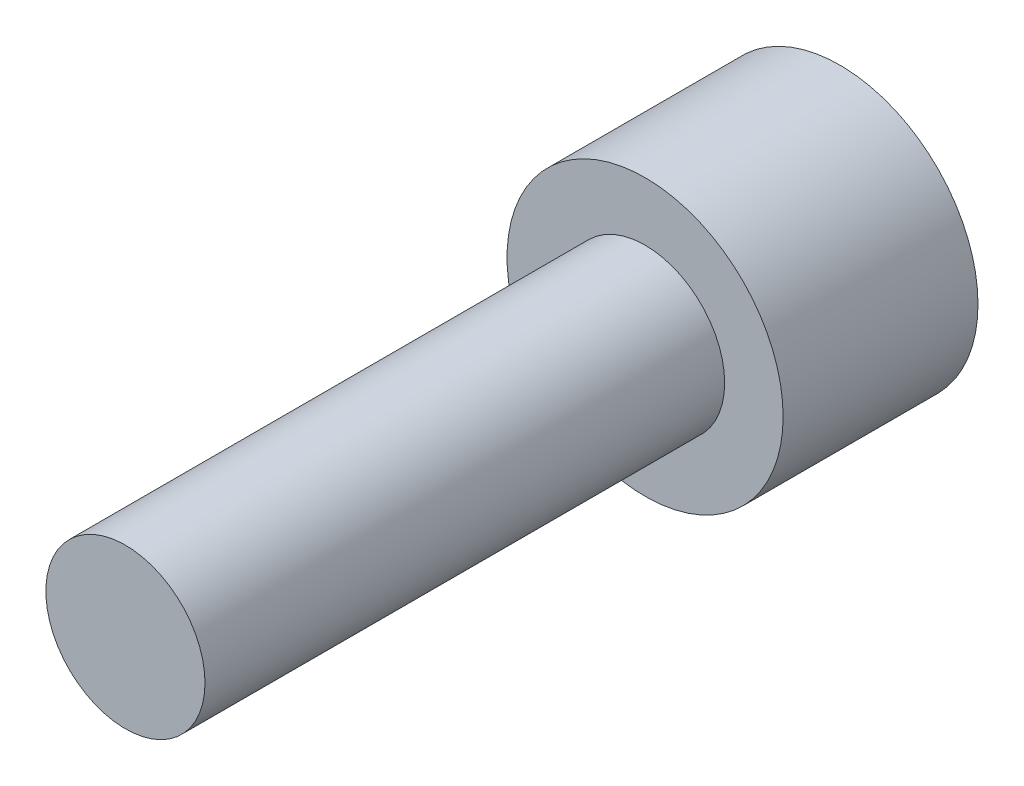
ISO-10303-21;
HEADER;
FILE_DESCRIPTION(('STEP AP214'),'2;1');
FILE_NAME('part.step','',(''),(''),'','','');
FILE_SCHEMA(('AUTOMOTIVE_DESIGN { 1 0 10303 214 1 1 1 1 }'));
ENDSEC;
DATA;
#1=APPLICATION_CONTEXT('core data for automotive mechanical design processes');
#2=APPLICATION_PROTOCOL_DEFINITION('international standard','automotive_design',2000,#1);
#3=PRODUCT_CONTEXT('',#1,'mechanical');
#4=PRODUCT('Part','Part','',(#3));
#5=PRODUCT_RELATED_PRODUCT_CATEGORY('part','',(#4));
#6=PRODUCT_DEFINITION_FORMATION('','',#4);
#7=PRODUCT_DEFINITION_CONTEXT('part definition',#1,'design');
#8=PRODUCT_DEFINITION('design','',#6,#7);
#9=PRODUCT_DEFINITION_SHAPE('','',#8);
#10=(LENGTH_UNIT() NAMED_UNIT(*) SI_UNIT(.MILLI.,.METRE.));
#11=(NAMED_UNIT(*) PLANE_ANGLE_UNIT() SI_UNIT($,.RADIAN.));
#12=(NAMED_UNIT(*) SI_UNIT($,.STERADIAN.) SOLID_ANGLE_UNIT());
#13=UNCERTAINTY_MEASURE_WITH_UNIT(LENGTH_MEASURE(1.E-05),#10,'distance_accuracy_value','');
#14=(GEOMETRIC_REPRESENTATION_CONTEXT(3) GLOBAL_UNCERTAINTY_ASSIGNED_CONTEXT((#13)) GLOBAL_UNIT_ASSIGNED_CONTEXT((#10,
#11,#12)) REPRESENTATION_CONTEXT('',''));
#15=CARTESIAN_POINT('',(0.,0.,0.));
#16=DIRECTION('',(0.,0.,1.));
#17=DIRECTION('',(1.,0.,0.));
#18=AXIS2_PLACEMENT_3D('',#15,#16,#17);
#19=CARTESIAN_POINT('',(0.,0.,6.));
#20=DIRECTION('',(0.,0.,-1.));
#21=DIRECTION('',(-1.,0.,0.));
#22=AXIS2_PLACEMENT_3D('',#19,#20,#21);
#23=CYLINDRICAL_SURFACE('',#22,4.25);
#24=CARTESIAN_POINT('',(0.,0.,6.));
#25=DIRECTION('',(0.,0.,1.));
#26=DIRECTION('',(1.,0.,0.));
#27=AXIS2_PLACEMENT_3D('',#24,#25,#26);
#28=CIRCLE('',#27,4.25);
#29=CARTESIAN_POINT('',(4.25,0.,6.));
#30=VERTEX_POINT('',#29);
#31=EDGE_CURVE('E40',#30,#30,#28,.T.);
#32=ORIENTED_EDGE('',*,*,#31,.F.);
#33=EDGE_LOOP('',(#32));
#34=FACE_BOUND('',#33,.T.);
#35=CARTESIAN_POINT('',(0.,0.,0.));
#36=DIRECTION('',(0.,0.,1.));
#37=DIRECTION('',(1.,0.,0.));
#38=AXIS2_PLACEMENT_3D('',#35,#36,#37);
#39=CIRCLE('',#38,4.25);
#40=CARTESIAN_POINT('',(4.25,0.,0.));
#41=VERTEX_POINT('',#40);
#42=EDGE_CURVE('E36',#41,#41,#39,.T.);
#43=ORIENTED_EDGE('',*,*,#42,.T.);
#44=EDGE_LOOP('',(#43));
#45=FACE_BOUND('',#44,.T.);
#46=ADVANCED_FACE('F33',(#34,#45),#23,.T.);
#47=CARTESIAN_POINT('',(0.,0.,6.));
#48=DIRECTION('',(0.,0.,1.));
#49=DIRECTION('',(1.,0.,0.));
#50=AXIS2_PLACEMENT_3D('',#47,#48,#49);
#51=PLANE('',#50);
#52=CARTESIAN_POINT('',(0.,0.,6.));
#53=DIRECTION('',(0.,0.,1.));
#54=DIRECTION('',(1.,0.,0.));
#55=AXIS2_PLACEMENT_3D('',#52,#53,#54);
#56=CIRCLE('',#55,2.45);
#57=CARTESIAN_POINT('',(2.45,0.,6.));
#58=VERTEX_POINT('',#57);
#59=EDGE_CURVE('E10',#58,#58,#56,.T.);
#60=ORIENTED_EDGE('',*,*,#59,.F.);
#61=EDGE_LOOP('',(#60));
#62=FACE_BOUND('',#61,.T.);
#63=ORIENTED_EDGE('',*,*,#31,.T.);
#64=EDGE_LOOP('',(#63));
#65=FACE_BOUND('',#64,.T.);
#66=ADVANCED_FACE('F57',(#62,#65),#51,.T.);
#67=CARTESIAN_POINT('',(0.,0.,0.));
#68=DIRECTION('',(0.,0.,1.));
#69=DIRECTION('',(1.,0.,0.));
#70=AXIS2_PLACEMENT_3D('',#67,#68,#69);
#71=PLANE('',#70);
#72=ORIENTED_EDGE('',*,*,#42,.F.);
#73=EDGE_LOOP('',(#72));
#74=FACE_BOUND('',#73,.T.);
#75=ADVANCED_FACE('F54',(#74),#71,.F.);
#76=CARTESIAN_POINT('',(0.,0.,22.));
#77=DIRECTION('',(0.,0.,-1.));
#78=DIRECTION('',(-1.,0.,0.));
#79=AXIS2_PLACEMENT_3D('',#76,#77,#78);
#80=CYLINDRICAL_SURFACE('',#79,2.45);
#81=CARTESIAN_POINT('',(0.,0.,22.));
#82=DIRECTION('',(0.,0.,1.));
#83=DIRECTION('',(1.,0.,0.));
#84=AXIS2_PLACEMENT_3D('',#81,#82,#83);
#85=CIRCLE('',#84,2.45);
#86=CARTESIAN_POINT('',(2.45,0.,22.));
#87=VERTEX_POINT('',#86);
#88=EDGE_CURVE('E46',#87,#87,#85,.T.);
#89=ORIENTED_EDGE('',*,*,#88,.F.);
#90=EDGE_LOOP('',(#89));
#91=FACE_BOUND('',#90,.T.);
#92=ORIENTED_EDGE('',*,*,#59,.T.);
#93=EDGE_LOOP('',(#92));
#94=FACE_BOUND('',#93,.T.);
#95=ADVANCED_FACE('F56',(#91,#94),#80,.T.);
#96=CARTESIAN_POINT('',(0.,0.,22.));
#97=DIRECTION('',(0.,0.,1.));
#98=DIRECTION('',(1.,0.,0.));
#99=AXIS2_PLACEMENT_3D('',#96,#97,#98);
#100=PLANE('',#99);
#101=ORIENTED_EDGE('',*,*,#88,.T.);
#102=EDGE_LOOP('',(#101));
#103=FACE_BOUND('',#102,.T.);
#104=ADVANCED_FACE('F62',(#103),#100,.T.);
#105=CLOSED_SHELL('',(#46,#66,#75,#95,#104));
#106=MANIFOLD_SOLID_BREP('B2',#105);
#107=ADVANCED_BREP_SHAPE_REPRESENTATION('',(#18,#106),#14);
#108=SHAPE_DEFINITION_REPRESENTATION(#9,#107);
ENDSEC;
END-ISO-10303-21;
